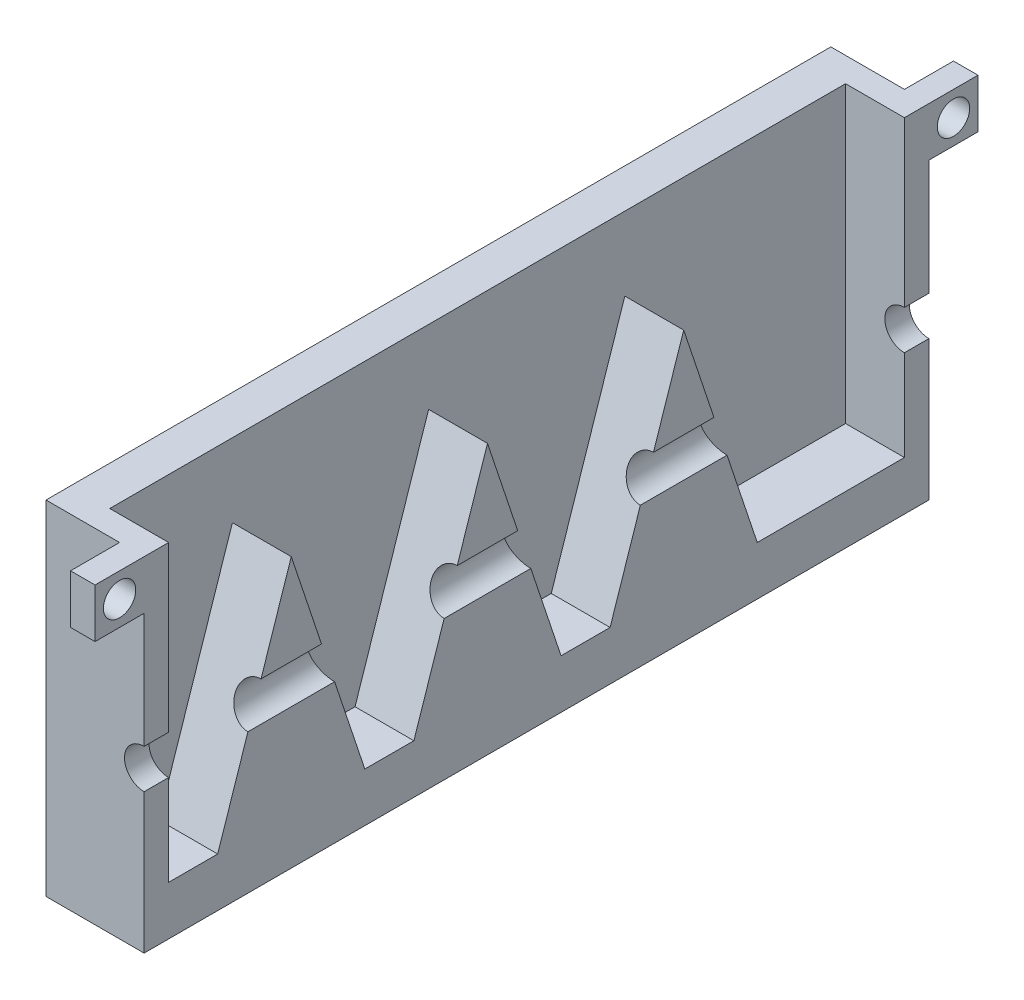
ISO-10303-21;
HEADER;
FILE_DESCRIPTION(('STEP AP214'),'2;1');
FILE_NAME('part.step','',(''),(''),'','','');
FILE_SCHEMA(('AUTOMOTIVE_DESIGN { 1 0 10303 214 1 1 1 1 }'));
ENDSEC;
DATA;
#1=APPLICATION_CONTEXT('core data for automotive mechanical design processes');
#2=APPLICATION_PROTOCOL_DEFINITION('international standard','automotive_design',2000,#1);
#3=PRODUCT_CONTEXT('',#1,'mechanical');
#4=PRODUCT('Part','Part','',(#3));
#5=PRODUCT_RELATED_PRODUCT_CATEGORY('part','',(#4));
#6=PRODUCT_DEFINITION_FORMATION('','',#4);
#7=PRODUCT_DEFINITION_CONTEXT('part definition',#1,'design');
#8=PRODUCT_DEFINITION('design','',#6,#7);
#9=PRODUCT_DEFINITION_SHAPE('','',#8);
#10=(LENGTH_UNIT() NAMED_UNIT(*) SI_UNIT(.MILLI.,.METRE.));
#11=(NAMED_UNIT(*) PLANE_ANGLE_UNIT() SI_UNIT($,.RADIAN.));
#12=(NAMED_UNIT(*) SI_UNIT($,.STERADIAN.) SOLID_ANGLE_UNIT());
#13=UNCERTAINTY_MEASURE_WITH_UNIT(LENGTH_MEASURE(1.E-05),#10,'distance_accuracy_value','');
#14=(GEOMETRIC_REPRESENTATION_CONTEXT(3) GLOBAL_UNCERTAINTY_ASSIGNED_CONTEXT((#13)) GLOBAL_UNIT_ASSIGNED_CONTEXT((#10,
#11,#12)) REPRESENTATION_CONTEXT('',''));
#15=CARTESIAN_POINT('',(0.,0.,0.));
#16=DIRECTION('',(0.,0.,1.));
#17=DIRECTION('',(1.,0.,0.));
#18=AXIS2_PLACEMENT_3D('',#15,#16,#17);
#19=CARTESIAN_POINT('',(10.,0.,0.));
#20=DIRECTION('',(-1.,0.,0.));
#21=DIRECTION('',(0.,0.,1.));
#22=AXIS2_PLACEMENT_3D('',#19,#20,#21);
#23=PLANE('',#22);
#24=DIRECTION('',(0.,0.948683298050514,-0.316227766016838));
#25=VECTOR('',#24,1.);
#26=CARTESIAN_POINT('',(9.99999999999999,5.00000000000001,-27.5));
#27=LINE('',#26,#25);
#28=CARTESIAN_POINT('',(9.99999999999998,18.25,-31.9166666666667));
#29=VERTEX_POINT('',#28);
#30=CARTESIAN_POINT('',(9.99999999999999,27.5,-35.));
#31=VERTEX_POINT('',#30);
#32=EDGE_CURVE('E423',#29,#31,#27,.T.);
#33=ORIENTED_EDGE('',*,*,#32,.F.);
#34=DIRECTION('',(0.,0.,1.));
#35=VECTOR('',#34,1.);
#36=CARTESIAN_POINT('',(9.99999999999998,18.25,-85.6568542494924));
#37=LINE('',#36,#35);
#38=CARTESIAN_POINT('',(9.99999999999998,18.25,-38.0833333333333));
#39=VERTEX_POINT('',#38);
#40=EDGE_CURVE('E459',#39,#29,#37,.T.);
#41=ORIENTED_EDGE('',*,*,#40,.F.);
#42=DIRECTION('',(0.,-0.948683298050514,-0.316227766016838));
#43=VECTOR('',#42,1.);
#44=CARTESIAN_POINT('',(9.99999999999999,27.5,-35.));
#45=LINE('',#44,#43);
#46=EDGE_CURVE('E463',#31,#39,#45,.T.);
#47=ORIENTED_EDGE('',*,*,#46,.F.);
#48=EDGE_LOOP('',(#33,#41,#47));
#49=FACE_BOUND('',#48,.T.);
#50=ADVANCED_FACE('F32',(#49),#23,.F.);
#51=DIRECTION('',(0.,0.948683298050514,-0.316227766016838));
#52=VECTOR('',#51,1.);
#53=CARTESIAN_POINT('',(9.99999999999999,5.00000000000001,-47.5));
#54=LINE('',#53,#52);
#55=CARTESIAN_POINT('',(9.99999999999998,18.25,-51.9166666666667));
#56=VERTEX_POINT('',#55);
#57=CARTESIAN_POINT('',(9.99999999999999,27.5,-55.));
#58=VERTEX_POINT('',#57);
#59=EDGE_CURVE('E465',#56,#58,#54,.T.);
#60=ORIENTED_EDGE('',*,*,#59,.F.);
#61=DIRECTION('',(0.,0.,1.));
#62=VECTOR('',#61,1.);
#63=CARTESIAN_POINT('',(9.99999999999998,18.25,-85.6568542494924));
#64=LINE('',#63,#62);
#65=CARTESIAN_POINT('',(9.99999999999998,18.25,-58.0833333333334));
#66=VERTEX_POINT('',#65);
#67=EDGE_CURVE('E441',#66,#56,#64,.T.);
#68=ORIENTED_EDGE('',*,*,#67,.F.);
#69=DIRECTION('',(0.,-0.948683298050514,-0.316227766016838));
#70=VECTOR('',#69,1.);
#71=CARTESIAN_POINT('',(9.99999999999999,27.5,-55.));
#72=LINE('',#71,#70);
#73=EDGE_CURVE('E454',#58,#66,#72,.T.);
#74=ORIENTED_EDGE('',*,*,#73,.F.);
#75=EDGE_LOOP('',(#60,#68,#74));
#76=FACE_BOUND('',#75,.T.);
#77=ADVANCED_FACE('F538',(#76),#23,.F.);
#78=DIRECTION('',(0.,0.948683298050514,-0.316227766016838));
#79=VECTOR('',#78,1.);
#80=CARTESIAN_POINT('',(10.,5.00000000000001,-7.50000000000001));
#81=LINE('',#80,#79);
#82=CARTESIAN_POINT('',(9.99999999999998,18.25,-11.9166666666667));
#83=VERTEX_POINT('',#82);
#84=CARTESIAN_POINT('',(10.,27.5,-15.));
#85=VERTEX_POINT('',#84);
#86=EDGE_CURVE('E431',#83,#85,#81,.T.);
#87=ORIENTED_EDGE('',*,*,#86,.F.);
#88=DIRECTION('',(0.,0.,1.));
#89=VECTOR('',#88,1.);
#90=CARTESIAN_POINT('',(9.99999999999998,18.25,-85.6568542494924));
#91=LINE('',#90,#89);
#92=CARTESIAN_POINT('',(9.99999999999998,18.25,-18.0833333333334));
#93=VERTEX_POINT('',#92);
#94=EDGE_CURVE('E438',#93,#83,#91,.T.);
#95=ORIENTED_EDGE('',*,*,#94,.F.);
#96=DIRECTION('',(0.,-0.948683298050514,-0.316227766016838));
#97=VECTOR('',#96,1.);
#98=CARTESIAN_POINT('',(10.,27.5,-15.));
#99=LINE('',#98,#97);
#100=EDGE_CURVE('E434',#85,#93,#99,.T.);
#101=ORIENTED_EDGE('',*,*,#100,.F.);
#102=EDGE_LOOP('',(#87,#95,#101));
#103=FACE_BOUND('',#102,.T.);
#104=ADVANCED_FACE('F543',(#103),#23,.F.);
#105=CARTESIAN_POINT('',(9.99999999999998,32.5,-82.5));
#106=DIRECTION('',(-1.,0.,0.));
#107=DIRECTION('',(0.,0.,1.));
#108=AXIS2_PLACEMENT_3D('',#105,#106,#107);
#109=CIRCLE('',#108,1.65);
#110=CARTESIAN_POINT('',(9.99999999999998,32.5,-80.85));
#111=VERTEX_POINT('',#110);
#112=EDGE_CURVE('E11',#111,#111,#109,.T.);
#113=ORIENTED_EDGE('',*,*,#112,.T.);
#114=EDGE_LOOP('',(#113));
#115=FACE_BOUND('',#114,.T.);
#116=DIRECTION('',(0.,0.,-1.));
#117=VECTOR('',#116,1.);
#118=CARTESIAN_POINT('',(9.99999999999998,30.,-85.));
#119=LINE('',#118,#117);
#120=CARTESIAN_POINT('',(9.99999999999998,30.,-80.));
#121=VERTEX_POINT('',#120);
#122=CARTESIAN_POINT('',(9.99999999999998,30.,-85.));
#123=VERTEX_POINT('',#122);
#124=EDGE_CURVE('E41',#121,#123,#119,.T.);
#125=ORIENTED_EDGE('',*,*,#124,.T.);
#126=DIRECTION('',(0.,-1.,0.));
#127=VECTOR('',#126,1.);
#128=CARTESIAN_POINT('',(9.99999999999998,0.,-85.));
#129=LINE('',#128,#127);
#130=CARTESIAN_POINT('',(9.99999999999998,35.,-85.));
#131=VERTEX_POINT('',#130);
#132=EDGE_CURVE('E462',#131,#123,#129,.T.);
#133=ORIENTED_EDGE('',*,*,#132,.F.);
#134=DIRECTION('',(0.,0.,1.));
#135=VECTOR('',#134,1.);
#136=CARTESIAN_POINT('',(10.,35.,0.));
#137=LINE('',#136,#135);
#138=CARTESIAN_POINT('',(9.99999999999998,35.,-77.5));
#139=VERTEX_POINT('',#138);
#140=EDGE_CURVE('E267',#131,#139,#137,.T.);
#141=ORIENTED_EDGE('',*,*,#140,.T.);
#142=DIRECTION('',(0.,-1.,0.));
#143=VECTOR('',#142,1.);
#144=CARTESIAN_POINT('',(9.99999999999998,5.00000000000001,-77.5));
#145=LINE('',#144,#143);
#146=CARTESIAN_POINT('',(9.99999999999998,18.25,-77.5));
#147=VERTEX_POINT('',#146);
#148=EDGE_CURVE('E56',#139,#147,#145,.T.);
#149=ORIENTED_EDGE('',*,*,#148,.T.);
#150=DIRECTION('',(0.,0.,1.));
#151=VECTOR('',#150,1.);
#152=CARTESIAN_POINT('',(9.99999999999998,18.25,-85.6568542494924));
#153=LINE('',#152,#151);
#154=CARTESIAN_POINT('',(9.99999999999998,18.25,-80.));
#155=VERTEX_POINT('',#154);
#156=EDGE_CURVE('E406',#155,#147,#153,.T.);
#157=ORIENTED_EDGE('',*,*,#156,.F.);
#158=DIRECTION('',(0.,1.,0.));
#159=VECTOR('',#158,1.);
#160=CARTESIAN_POINT('',(9.99999999999998,35.,-80.));
#161=LINE('',#160,#159);
#162=EDGE_CURVE('E48',#155,#121,#161,.T.);
#163=ORIENTED_EDGE('',*,*,#162,.T.);
#164=EDGE_LOOP('',(#125,#133,#141,#149,#157,#163));
#165=FACE_BOUND('',#164,.T.);
#166=ADVANCED_FACE('F556',(#115,#165),#23,.F.);
#167=DIRECTION('',(0.,0.,1.));
#168=VECTOR('',#167,1.);
#169=CARTESIAN_POINT('',(10.,5.00000000000001,-2.50000000000001));
#170=LINE('',#169,#168);
#171=CARTESIAN_POINT('',(9.99999999999999,5.00000000000001,-47.5));
#172=VERTEX_POINT('',#171);
#173=CARTESIAN_POINT('',(9.99999999999999,5.00000000000001,-42.5));
#174=VERTEX_POINT('',#173);
#175=EDGE_CURVE('E418',#172,#174,#170,.T.);
#176=ORIENTED_EDGE('',*,*,#175,.T.);
#177=CARTESIAN_POINT('',(9.99999999999998,14.25,-39.4166666666667));
#178=VERTEX_POINT('',#177);
#179=EDGE_CURVE('E453',#178,#174,#45,.T.);
#180=ORIENTED_EDGE('',*,*,#179,.F.);
#181=DIRECTION('',(0.,0.,1.));
#182=VECTOR('',#181,1.);
#183=CARTESIAN_POINT('',(9.99999999999998,14.25,-85.6568542494924));
#184=LINE('',#183,#182);
#185=CARTESIAN_POINT('',(9.99999999999998,14.25,-30.5833333333333));
#186=VERTEX_POINT('',#185);
#187=EDGE_CURVE('E460',#186,#178,#184,.F.);
#188=ORIENTED_EDGE('',*,*,#187,.F.);
#189=CARTESIAN_POINT('',(9.99999999999999,5.00000000000001,-27.5));
#190=VERTEX_POINT('',#189);
#191=EDGE_CURVE('E451',#190,#186,#27,.T.);
#192=ORIENTED_EDGE('',*,*,#191,.F.);
#193=DIRECTION('',(0.,0.,1.));
#194=VECTOR('',#193,1.);
#195=CARTESIAN_POINT('',(10.,5.00000000000001,-2.50000000000001));
#196=LINE('',#195,#194);
#197=CARTESIAN_POINT('',(10.,5.00000000000001,-22.5));
#198=VERTEX_POINT('',#197);
#199=EDGE_CURVE('E448',#190,#198,#196,.T.);
#200=ORIENTED_EDGE('',*,*,#199,.T.);
#201=CARTESIAN_POINT('',(9.99999999999998,14.25,-19.4166666666667));
#202=VERTEX_POINT('',#201);
#203=EDGE_CURVE('E430',#202,#198,#99,.T.);
#204=ORIENTED_EDGE('',*,*,#203,.F.);
#205=DIRECTION('',(0.,0.,1.));
#206=VECTOR('',#205,1.);
#207=CARTESIAN_POINT('',(9.99999999999998,14.25,-85.6568542494924));
#208=LINE('',#207,#206);
#209=CARTESIAN_POINT('',(9.99999999999998,14.25,-10.5833333333334));
#210=VERTEX_POINT('',#209);
#211=EDGE_CURVE('E439',#210,#202,#208,.F.);
#212=ORIENTED_EDGE('',*,*,#211,.F.);
#213=CARTESIAN_POINT('',(10.,5.00000000000001,-7.50000000000001));
#214=VERTEX_POINT('',#213);
#215=EDGE_CURVE('E428',#214,#210,#81,.T.);
#216=ORIENTED_EDGE('',*,*,#215,.F.);
#217=DIRECTION('',(0.,0.,1.));
#218=VECTOR('',#217,1.);
#219=CARTESIAN_POINT('',(10.,5.00000000000001,-2.50000000000001));
#220=LINE('',#219,#218);
#221=CARTESIAN_POINT('',(10.,5.00000000000001,-2.50000000000001));
#222=VERTEX_POINT('',#221);
#223=EDGE_CURVE('E424',#214,#222,#220,.T.);
#224=ORIENTED_EDGE('',*,*,#223,.T.);
#225=DIRECTION('',(0.,1.,0.));
#226=VECTOR('',#225,1.);
#227=CARTESIAN_POINT('',(10.,5.00000000000001,-2.50000000000001));
#228=LINE('',#227,#226);
#229=CARTESIAN_POINT('',(9.99999999999998,14.25,-2.50000000000002));
#230=VERTEX_POINT('',#229);
#231=EDGE_CURVE('E410',#222,#230,#228,.T.);
#232=ORIENTED_EDGE('',*,*,#231,.T.);
#233=DIRECTION('',(0.,0.,1.));
#234=VECTOR('',#233,1.);
#235=CARTESIAN_POINT('',(9.99999999999998,14.25,-85.6568542494924));
#236=LINE('',#235,#234);
#237=CARTESIAN_POINT('',(9.99999999999998,14.25,0.));
#238=VERTEX_POINT('',#237);
#239=EDGE_CURVE('E404',#238,#230,#236,.F.);
#240=ORIENTED_EDGE('',*,*,#239,.F.);
#241=DIRECTION('',(0.,1.,0.));
#242=VECTOR('',#241,1.);
#243=CARTESIAN_POINT('',(10.,35.,0.));
#244=LINE('',#243,#242);
#245=CARTESIAN_POINT('',(9.99999999999999,0.,0.));
#246=VERTEX_POINT('',#245);
#247=EDGE_CURVE('E411',#246,#238,#244,.T.);
#248=ORIENTED_EDGE('',*,*,#247,.F.);
#249=DIRECTION('',(0.,0.,1.));
#250=VECTOR('',#249,1.);
#251=CARTESIAN_POINT('',(10.,0.,0.));
#252=LINE('',#251,#250);
#253=CARTESIAN_POINT('',(9.99999999999999,0.,-80.));
#254=VERTEX_POINT('',#253);
#255=EDGE_CURVE('E432',#254,#246,#252,.T.);
#256=ORIENTED_EDGE('',*,*,#255,.F.);
#257=CARTESIAN_POINT('',(9.99999999999998,14.25,-80.));
#258=VERTEX_POINT('',#257);
#259=EDGE_CURVE('E413',#254,#258,#161,.T.);
#260=ORIENTED_EDGE('',*,*,#259,.T.);
#261=DIRECTION('',(0.,0.,1.));
#262=VECTOR('',#261,1.);
#263=CARTESIAN_POINT('',(9.99999999999998,14.25,-85.6568542494924));
#264=LINE('',#263,#262);
#265=CARTESIAN_POINT('',(9.99999999999998,14.25,-77.5));
#266=VERTEX_POINT('',#265);
#267=EDGE_CURVE('E436',#266,#258,#264,.F.);
#268=ORIENTED_EDGE('',*,*,#267,.F.);
#269=CARTESIAN_POINT('',(9.99999999999998,5.00000000000001,-77.5));
#270=VERTEX_POINT('',#269);
#271=EDGE_CURVE('E443',#266,#270,#145,.T.);
#272=ORIENTED_EDGE('',*,*,#271,.T.);
#273=DIRECTION('',(0.,0.,1.));
#274=VECTOR('',#273,1.);
#275=CARTESIAN_POINT('',(10.,5.00000000000001,-2.50000000000001));
#276=LINE('',#275,#274);
#277=CARTESIAN_POINT('',(9.99999999999999,5.00000000000001,-62.5));
#278=VERTEX_POINT('',#277);
#279=EDGE_CURVE('E427',#270,#278,#276,.T.);
#280=ORIENTED_EDGE('',*,*,#279,.T.);
#281=CARTESIAN_POINT('',(9.99999999999998,14.25,-59.4166666666667));
#282=VERTEX_POINT('',#281);
#283=EDGE_CURVE('E456',#282,#278,#72,.T.);
#284=ORIENTED_EDGE('',*,*,#283,.F.);
#285=DIRECTION('',(0.,0.,1.));
#286=VECTOR('',#285,1.);
#287=CARTESIAN_POINT('',(9.99999999999998,14.25,-85.6568542494924));
#288=LINE('',#287,#286);
#289=CARTESIAN_POINT('',(9.99999999999998,14.25,-50.5833333333333));
#290=VERTEX_POINT('',#289);
#291=EDGE_CURVE('E457',#290,#282,#288,.F.);
#292=ORIENTED_EDGE('',*,*,#291,.F.);
#293=EDGE_CURVE('E466',#172,#290,#54,.T.);
#294=ORIENTED_EDGE('',*,*,#293,.F.);
#295=EDGE_LOOP('',(#176,#180,#188,#192,#200,#204,#212,#216,#224,#232,#240,#248,#256,#260,#268,
#272,#280,#284,#292,#294));
#296=FACE_BOUND('',#295,.T.);
#297=ADVANCED_FACE('F34',(#296),#23,.F.);
#298=CARTESIAN_POINT('',(9.99999999999998,18.25,0.));
#299=VERTEX_POINT('',#298);
#300=CARTESIAN_POINT('',(10.,30.,0.));
#301=VERTEX_POINT('',#300);
#302=EDGE_CURVE('E414',#299,#301,#244,.T.);
#303=ORIENTED_EDGE('',*,*,#302,.F.);
#304=DIRECTION('',(0.,0.,1.));
#305=VECTOR('',#304,1.);
#306=CARTESIAN_POINT('',(9.99999999999998,18.25,-85.6568542494924));
#307=LINE('',#306,#305);
#308=CARTESIAN_POINT('',(9.99999999999998,18.25,-2.50000000000002));
#309=VERTEX_POINT('',#308);
#310=EDGE_CURVE('E397',#309,#299,#307,.T.);
#311=ORIENTED_EDGE('',*,*,#310,.F.);
#312=CARTESIAN_POINT('',(10.,35.,-2.50000000000001));
#313=VERTEX_POINT('',#312);
#314=EDGE_CURVE('E407',#309,#313,#228,.T.);
#315=ORIENTED_EDGE('',*,*,#314,.T.);
#316=CARTESIAN_POINT('',(10.,35.,5.));
#317=VERTEX_POINT('',#316);
#318=EDGE_CURVE('E415',#313,#317,#137,.T.);
#319=ORIENTED_EDGE('',*,*,#318,.T.);
#320=DIRECTION('',(0.,1.,0.));
#321=VECTOR('',#320,1.);
#322=CARTESIAN_POINT('',(10.,0.,5.));
#323=LINE('',#322,#321);
#324=CARTESIAN_POINT('',(10.,30.,5.));
#325=VERTEX_POINT('',#324);
#326=EDGE_CURVE('E419',#325,#317,#323,.T.);
#327=ORIENTED_EDGE('',*,*,#326,.F.);
#328=DIRECTION('',(0.,0.,1.));
#329=VECTOR('',#328,1.);
#330=CARTESIAN_POINT('',(10.,30.,5.));
#331=LINE('',#330,#329);
#332=EDGE_CURVE('E421',#301,#325,#331,.T.);
#333=ORIENTED_EDGE('',*,*,#332,.F.);
#334=EDGE_LOOP('',(#303,#311,#315,#319,#327,#333));
#335=FACE_BOUND('',#334,.T.);
#336=CARTESIAN_POINT('',(10.,32.5,2.5));
#337=DIRECTION('',(-1.,0.,0.));
#338=DIRECTION('',(0.,0.,1.));
#339=AXIS2_PLACEMENT_3D('',#336,#337,#338);
#340=CIRCLE('',#339,1.65);
#341=CARTESIAN_POINT('',(10.,32.5,4.15));
#342=VERTEX_POINT('',#341);
#343=EDGE_CURVE('E36',#342,#342,#340,.F.);
#344=ORIENTED_EDGE('',*,*,#343,.F.);
#345=EDGE_LOOP('',(#344));
#346=FACE_BOUND('',#345,.T.);
#347=ADVANCED_FACE('F539',(#335,#346),#23,.F.);
#348=CARTESIAN_POINT('',(0.,35.,0.));
#349=DIRECTION('',(-1.,0.,0.));
#350=DIRECTION('',(0.,0.,1.));
#351=AXIS2_PLACEMENT_3D('',#348,#349,#350);
#352=PLANE('',#351);
#353=DIRECTION('',(0.,0.,-1.));
#354=VECTOR('',#353,1.);
#355=CARTESIAN_POINT('',(0.,0.,0.));
#356=LINE('',#355,#354);
#357=CARTESIAN_POINT('',(0.,0.,0.));
#358=VERTEX_POINT('',#357);
#359=CARTESIAN_POINT('',(0.,0.,-80.));
#360=VERTEX_POINT('',#359);
#361=EDGE_CURVE('E381',#358,#360,#356,.T.);
#362=ORIENTED_EDGE('',*,*,#361,.F.);
#363=DIRECTION('',(0.,-1.,0.));
#364=VECTOR('',#363,1.);
#365=CARTESIAN_POINT('',(0.,35.,0.));
#366=LINE('',#365,#364);
#367=CARTESIAN_POINT('',(0.,35.,0.));
#368=VERTEX_POINT('',#367);
#369=EDGE_CURVE('E386',#368,#358,#366,.T.);
#370=ORIENTED_EDGE('',*,*,#369,.F.);
#371=DIRECTION('',(0.,0.,-1.));
#372=VECTOR('',#371,1.);
#373=CARTESIAN_POINT('',(0.,35.,0.));
#374=LINE('',#373,#372);
#375=CARTESIAN_POINT('',(0.,35.,-80.));
#376=VERTEX_POINT('',#375);
#377=EDGE_CURVE('E383',#368,#376,#374,.T.);
#378=ORIENTED_EDGE('',*,*,#377,.T.);
#379=DIRECTION('',(0.,-1.,0.));
#380=VECTOR('',#379,1.);
#381=CARTESIAN_POINT('',(0.,35.,-80.));
#382=LINE('',#381,#380);
#383=EDGE_CURVE('E395',#376,#360,#382,.T.);
#384=ORIENTED_EDGE('',*,*,#383,.T.);
#385=EDGE_LOOP('',(#362,#370,#378,#384));
#386=FACE_BOUND('',#385,.T.);
#387=ADVANCED_FACE('F546',(#386),#352,.T.);
#388=CARTESIAN_POINT('',(4.,5.00000000000001,-2.50000000000001));
#389=DIRECTION('',(0.,1.,0.));
#390=DIRECTION('',(0.,0.,-1.));
#391=AXIS2_PLACEMENT_3D('',#388,#389,#390);
#392=PLANE('',#391);
#393=ORIENTED_EDGE('',*,*,#279,.F.);
#394=DIRECTION('',(1.,0.,0.));
#395=VECTOR('',#394,1.);
#396=CARTESIAN_POINT('',(3.99999999999998,5.00000000000001,-77.5));
#397=LINE('',#396,#395);
#398=CARTESIAN_POINT('',(3.99999999999998,5.00000000000001,-77.5));
#399=VERTEX_POINT('',#398);
#400=EDGE_CURVE('E365',#399,#270,#397,.T.);
#401=ORIENTED_EDGE('',*,*,#400,.F.);
#402=DIRECTION('',(0.,0.,1.));
#403=VECTOR('',#402,1.);
#404=CARTESIAN_POINT('',(4.,5.00000000000001,-2.50000000000001));
#405=LINE('',#404,#403);
#406=CARTESIAN_POINT('',(3.99999999999999,5.00000000000001,-62.5));
#407=VERTEX_POINT('',#406);
#408=EDGE_CURVE('E353',#399,#407,#405,.T.);
#409=ORIENTED_EDGE('',*,*,#408,.T.);
#410=DIRECTION('',(1.,0.,0.));
#411=VECTOR('',#410,1.);
#412=CARTESIAN_POINT('',(-23.0416345659799,5.00000000000001,-62.5));
#413=LINE('',#412,#411);
#414=EDGE_CURVE('E305',#407,#278,#413,.T.);
#415=ORIENTED_EDGE('',*,*,#414,.T.);
#416=EDGE_LOOP('',(#393,#401,#409,#415));
#417=FACE_BOUND('',#416,.T.);
#418=ADVANCED_FACE('F553',(#417),#392,.T.);
#419=ORIENTED_EDGE('',*,*,#175,.F.);
#420=DIRECTION('',(1.,0.,0.));
#421=VECTOR('',#420,1.);
#422=CARTESIAN_POINT('',(-23.0416345659799,5.00000000000001,-47.5));
#423=LINE('',#422,#421);
#424=CARTESIAN_POINT('',(3.99999999999999,5.00000000000001,-47.5));
#425=VERTEX_POINT('',#424);
#426=EDGE_CURVE('E333',#425,#172,#423,.T.);
#427=ORIENTED_EDGE('',*,*,#426,.F.);
#428=CARTESIAN_POINT('',(3.99999999999999,5.00000000000001,-42.5));
#429=VERTEX_POINT('',#428);
#430=EDGE_CURVE('E357',#425,#429,#405,.T.);
#431=ORIENTED_EDGE('',*,*,#430,.T.);
#432=DIRECTION('',(1.,0.,0.));
#433=VECTOR('',#432,1.);
#434=CARTESIAN_POINT('',(-23.0416345659799,5.00000000000001,-42.5));
#435=LINE('',#434,#433);
#436=EDGE_CURVE('E313',#429,#174,#435,.T.);
#437=ORIENTED_EDGE('',*,*,#436,.T.);
#438=EDGE_LOOP('',(#419,#427,#431,#437));
#439=FACE_BOUND('',#438,.T.);
#440=ADVANCED_FACE('F642',(#439),#392,.T.);
#441=CARTESIAN_POINT('',(4.,5.00000000000001,-2.50000000000001));
#442=DIRECTION('',(1.,0.,0.));
#443=DIRECTION('',(0.,0.,-1.));
#444=AXIS2_PLACEMENT_3D('',#441,#442,#443);
#445=PLANE('',#444);
#446=DIRECTION('',(0.,0.948683298050514,0.316227766016838));
#447=VECTOR('',#446,1.);
#448=CARTESIAN_POINT('',(3.99999999999999,27.5,-35.));
#449=LINE('',#448,#447);
#450=CARTESIAN_POINT('',(3.99999999999999,27.5,-35.));
#451=VERTEX_POINT('',#450);
#452=EDGE_CURVE('E312',#429,#451,#449,.T.);
#453=ORIENTED_EDGE('',*,*,#452,.F.);
#454=ORIENTED_EDGE('',*,*,#430,.F.);
#455=DIRECTION('',(0.,-0.948683298050514,0.316227766016838));
#456=VECTOR('',#455,1.);
#457=CARTESIAN_POINT('',(3.99999999999999,5.00000000000001,-47.5));
#458=LINE('',#457,#456);
#459=CARTESIAN_POINT('',(3.99999999999999,27.5,-55.));
#460=VERTEX_POINT('',#459);
#461=EDGE_CURVE('E317',#460,#425,#458,.T.);
#462=ORIENTED_EDGE('',*,*,#461,.F.);
#463=DIRECTION('',(0.,0.948683298050514,0.316227766016838));
#464=VECTOR('',#463,1.);
#465=CARTESIAN_POINT('',(3.99999999999999,27.5,-55.));
#466=LINE('',#465,#464);
#467=EDGE_CURVE('E327',#407,#460,#466,.T.);
#468=ORIENTED_EDGE('',*,*,#467,.F.);
#469=ORIENTED_EDGE('',*,*,#408,.F.);
#470=DIRECTION('',(0.,-1.,0.));
#471=VECTOR('',#470,1.);
#472=CARTESIAN_POINT('',(3.99999999999998,5.00000000000001,-77.5));
#473=LINE('',#472,#471);
#474=CARTESIAN_POINT('',(3.99999999999998,35.,-77.5));
#475=VERTEX_POINT('',#474);
#476=EDGE_CURVE('E363',#475,#399,#473,.T.);
#477=ORIENTED_EDGE('',*,*,#476,.F.);
#478=DIRECTION('',(0.,0.,-1.));
#479=VECTOR('',#478,1.);
#480=CARTESIAN_POINT('',(4.,35.,-2.50000000000001));
#481=LINE('',#480,#479);
#482=CARTESIAN_POINT('',(4.,35.,-2.50000000000001));
#483=VERTEX_POINT('',#482);
#484=EDGE_CURVE('E360',#483,#475,#481,.T.);
#485=ORIENTED_EDGE('',*,*,#484,.F.);
#486=DIRECTION('',(0.,1.,0.));
#487=VECTOR('',#486,1.);
#488=CARTESIAN_POINT('',(4.,5.00000000000001,-2.50000000000001));
#489=LINE('',#488,#487);
#490=CARTESIAN_POINT('',(4.,5.00000000000001,-2.50000000000001));
#491=VERTEX_POINT('',#490);
#492=EDGE_CURVE('E356',#491,#483,#489,.T.);
#493=ORIENTED_EDGE('',*,*,#492,.F.);
#494=CARTESIAN_POINT('',(4.,5.00000000000001,-7.50000000000001));
#495=VERTEX_POINT('',#494);
#496=EDGE_CURVE('E341',#495,#491,#405,.T.);
#497=ORIENTED_EDGE('',*,*,#496,.F.);
#498=DIRECTION('',(0.,-0.948683298050514,0.316227766016838));
#499=VECTOR('',#498,1.);
#500=CARTESIAN_POINT('',(4.,5.00000000000001,-7.50000000000001));
#501=LINE('',#500,#499);
#502=CARTESIAN_POINT('',(4.,27.5,-15.));
#503=VERTEX_POINT('',#502);
#504=EDGE_CURVE('E338',#503,#495,#501,.T.);
#505=ORIENTED_EDGE('',*,*,#504,.F.);
#506=DIRECTION('',(0.,0.948683298050514,0.316227766016838));
#507=VECTOR('',#506,1.);
#508=CARTESIAN_POINT('',(4.,27.5,-15.));
#509=LINE('',#508,#507);
#510=CARTESIAN_POINT('',(3.99999999999999,5.00000000000001,-22.5));
#511=VERTEX_POINT('',#510);
#512=EDGE_CURVE('E342',#511,#503,#509,.T.);
#513=ORIENTED_EDGE('',*,*,#512,.F.);
#514=CARTESIAN_POINT('',(3.99999999999999,5.00000000000001,-27.5));
#515=VERTEX_POINT('',#514);
#516=EDGE_CURVE('E358',#515,#511,#405,.T.);
#517=ORIENTED_EDGE('',*,*,#516,.F.);
#518=DIRECTION('',(0.,-0.948683298050514,0.316227766016838));
#519=VECTOR('',#518,1.);
#520=CARTESIAN_POINT('',(3.99999999999999,5.00000000000001,-27.5));
#521=LINE('',#520,#519);
#522=EDGE_CURVE('E308',#451,#515,#521,.T.);
#523=ORIENTED_EDGE('',*,*,#522,.F.);
#524=EDGE_LOOP('',(#453,#454,#462,#468,#469,#477,#485,#493,#497,#505,#513,#517,#523));
#525=FACE_BOUND('',#524,.T.);
#526=ADVANCED_FACE('F624',(#525),#445,.T.);
#527=ORIENTED_EDGE('',*,*,#199,.F.);
#528=DIRECTION('',(1.,0.,0.));
#529=VECTOR('',#528,1.);
#530=CARTESIAN_POINT('',(-23.0416345659799,5.00000000000001,-27.5));
#531=LINE('',#530,#529);
#532=EDGE_CURVE('E320',#515,#190,#531,.T.);
#533=ORIENTED_EDGE('',*,*,#532,.F.);
#534=ORIENTED_EDGE('',*,*,#516,.T.);
#535=DIRECTION('',(1.,0.,0.));
#536=VECTOR('',#535,1.);
#537=CARTESIAN_POINT('',(-23.0416345659799,5.00000000000001,-22.5));
#538=LINE('',#537,#536);
#539=EDGE_CURVE('E311',#511,#198,#538,.T.);
#540=ORIENTED_EDGE('',*,*,#539,.T.);
#541=EDGE_LOOP('',(#527,#533,#534,#540));
#542=FACE_BOUND('',#541,.T.);
#543=ADVANCED_FACE('F664',(#542),#392,.T.);
#544=CARTESIAN_POINT('',(-23.0416345659799,27.5,-35.));
#545=DIRECTION('',(0.,-0.316227766016838,0.948683298050514));
#546=DIRECTION('',(0.,0.948683298050514,0.316227766016838));
#547=AXIS2_PLACEMENT_3D('',#544,#545,#546);
#548=PLANE('',#547);
#549=DIRECTION('',(1.,0.,0.));
#550=VECTOR('',#549,1.);
#551=CARTESIAN_POINT('',(-23.0416345659799,27.5,-35.));
#552=LINE('',#551,#550);
#553=EDGE_CURVE('E316',#451,#31,#552,.T.);
#554=ORIENTED_EDGE('',*,*,#553,.T.);
#555=ORIENTED_EDGE('',*,*,#46,.T.);
#556=CARTESIAN_POINT('',(10.,16.25,-38.75));
#557=DIRECTION('',(0.,-0.316227766016838,0.948683298050514));
#558=DIRECTION('',(0.,0.948683298050514,0.316227766016838));
#559=AXIS2_PLACEMENT_3D('',#556,#557,#558);
#560=ELLIPSE('',#559,2.10818510677892,2.);
#561=EDGE_CURVE('E401',#39,#178,#560,.T.);
#562=ORIENTED_EDGE('',*,*,#561,.T.);
#563=ORIENTED_EDGE('',*,*,#179,.T.);
#564=ORIENTED_EDGE('',*,*,#436,.F.);
#565=ORIENTED_EDGE('',*,*,#452,.T.);
#566=EDGE_LOOP('',(#554,#555,#562,#563,#564,#565));
#567=FACE_BOUND('',#566,.T.);
#568=ADVANCED_FACE('F494',(#567),#548,.F.);
#569=CARTESIAN_POINT('',(-23.0416345659799,5.00000000000001,-27.5));
#570=DIRECTION('',(0.,-0.316227766016838,-0.948683298050514));
#571=DIRECTION('',(0.,-0.948683298050514,0.316227766016838));
#572=AXIS2_PLACEMENT_3D('',#569,#570,#571);
#573=PLANE('',#572);
#574=ORIENTED_EDGE('',*,*,#532,.T.);
#575=ORIENTED_EDGE('',*,*,#191,.T.);
#576=CARTESIAN_POINT('',(10.,16.25,-31.25));
#577=DIRECTION('',(0.,-0.316227766016838,-0.948683298050514));
#578=DIRECTION('',(0.,-0.948683298050514,0.316227766016838));
#579=AXIS2_PLACEMENT_3D('',#576,#577,#578);
#580=ELLIPSE('',#579,2.10818510677892,2.);
#581=EDGE_CURVE('E398',#186,#29,#580,.T.);
#582=ORIENTED_EDGE('',*,*,#581,.T.);
#583=ORIENTED_EDGE('',*,*,#32,.T.);
#584=ORIENTED_EDGE('',*,*,#553,.F.);
#585=ORIENTED_EDGE('',*,*,#522,.T.);
#586=EDGE_LOOP('',(#574,#575,#582,#583,#584,#585));
#587=FACE_BOUND('',#586,.T.);
#588=ADVANCED_FACE('F486',(#587),#573,.F.);
#589=CARTESIAN_POINT('',(10.,16.25,-85.6568542494924));
#590=DIRECTION('',(0.,0.,1.));
#591=DIRECTION('',(1.,0.,0.));
#592=AXIS2_PLACEMENT_3D('',#589,#590,#591);
#593=CYLINDRICAL_SURFACE('',#592,2.);
#594=ORIENTED_EDGE('',*,*,#581,.F.);
#595=ORIENTED_EDGE('',*,*,#187,.T.);
#596=ORIENTED_EDGE('',*,*,#561,.F.);
#597=ORIENTED_EDGE('',*,*,#40,.T.);
#598=EDGE_LOOP('',(#594,#595,#596,#597));
#599=FACE_BOUND('',#598,.T.);
#600=ADVANCED_FACE('F480',(#599),#593,.F.);
#601=CARTESIAN_POINT('',(-23.0416345659799,27.5,-55.));
#602=DIRECTION('',(0.,-0.316227766016838,0.948683298050514));
#603=DIRECTION('',(0.,0.948683298050514,0.316227766016838));
#604=AXIS2_PLACEMENT_3D('',#601,#602,#603);
#605=PLANE('',#604);
#606=DIRECTION('',(1.,0.,0.));
#607=VECTOR('',#606,1.);
#608=CARTESIAN_POINT('',(-23.0416345659799,27.5,-55.));
#609=LINE('',#608,#607);
#610=EDGE_CURVE('E330',#460,#58,#609,.T.);
#611=ORIENTED_EDGE('',*,*,#610,.T.);
#612=ORIENTED_EDGE('',*,*,#73,.T.);
#613=CARTESIAN_POINT('',(10.,16.25,-58.75));
#614=DIRECTION('',(0.,-0.316227766016838,0.948683298050514));
#615=DIRECTION('',(0.,0.948683298050514,0.316227766016838));
#616=AXIS2_PLACEMENT_3D('',#613,#614,#615);
#617=ELLIPSE('',#616,2.10818510677892,2.);
#618=EDGE_CURVE('E498',#66,#282,#617,.T.);
#619=ORIENTED_EDGE('',*,*,#618,.T.);
#620=ORIENTED_EDGE('',*,*,#283,.T.);
#621=ORIENTED_EDGE('',*,*,#414,.F.);
#622=ORIENTED_EDGE('',*,*,#467,.T.);
#623=EDGE_LOOP('',(#611,#612,#619,#620,#621,#622));
#624=FACE_BOUND('',#623,.T.);
#625=ADVANCED_FACE('F633',(#624),#605,.F.);
#626=CARTESIAN_POINT('',(-23.0416345659799,5.00000000000001,-47.5));
#627=DIRECTION('',(0.,-0.316227766016838,-0.948683298050514));
#628=DIRECTION('',(0.,-0.948683298050514,0.316227766016838));
#629=AXIS2_PLACEMENT_3D('',#626,#627,#628);
#630=PLANE('',#629);
#631=ORIENTED_EDGE('',*,*,#426,.T.);
#632=ORIENTED_EDGE('',*,*,#293,.T.);
#633=CARTESIAN_POINT('',(10.,16.25,-51.25));
#634=DIRECTION('',(0.,-0.316227766016838,-0.948683298050514));
#635=DIRECTION('',(0.,-0.948683298050514,0.316227766016838));
#636=AXIS2_PLACEMENT_3D('',#633,#634,#635);
#637=ELLIPSE('',#636,2.10818510677892,2.);
#638=EDGE_CURVE('E495',#290,#56,#637,.T.);
#639=ORIENTED_EDGE('',*,*,#638,.T.);
#640=ORIENTED_EDGE('',*,*,#59,.T.);
#641=ORIENTED_EDGE('',*,*,#610,.F.);
#642=ORIENTED_EDGE('',*,*,#461,.T.);
#643=EDGE_LOOP('',(#631,#632,#639,#640,#641,#642));
#644=FACE_BOUND('',#643,.T.);
#645=ADVANCED_FACE('F639',(#644),#630,.F.);
#646=ORIENTED_EDGE('',*,*,#638,.F.);
#647=ORIENTED_EDGE('',*,*,#291,.T.);
#648=ORIENTED_EDGE('',*,*,#618,.F.);
#649=ORIENTED_EDGE('',*,*,#67,.T.);
#650=EDGE_LOOP('',(#646,#647,#648,#649));
#651=FACE_BOUND('',#650,.T.);
#652=ADVANCED_FACE('F534',(#651),#593,.F.);
#653=ORIENTED_EDGE('',*,*,#223,.F.);
#654=DIRECTION('',(1.,0.,0.));
#655=VECTOR('',#654,1.);
#656=CARTESIAN_POINT('',(-23.0416345659799,5.00000000000001,-7.50000000000001));
#657=LINE('',#656,#655);
#658=EDGE_CURVE('E348',#495,#214,#657,.T.);
#659=ORIENTED_EDGE('',*,*,#658,.F.);
#660=ORIENTED_EDGE('',*,*,#496,.T.);
#661=DIRECTION('',(1.,0.,0.));
#662=VECTOR('',#661,1.);
#663=CARTESIAN_POINT('',(4.,5.00000000000001,-2.50000000000001));
#664=LINE('',#663,#662);
#665=EDGE_CURVE('E373',#491,#222,#664,.T.);
#666=ORIENTED_EDGE('',*,*,#665,.T.);
#667=EDGE_LOOP('',(#653,#659,#660,#666));
#668=FACE_BOUND('',#667,.T.);
#669=ADVANCED_FACE('F651',(#668),#392,.T.);
#670=CARTESIAN_POINT('',(-23.0416345659799,27.5,-15.));
#671=DIRECTION('',(0.,-0.316227766016838,0.948683298050514));
#672=DIRECTION('',(0.,0.948683298050514,0.316227766016838));
#673=AXIS2_PLACEMENT_3D('',#670,#671,#672);
#674=PLANE('',#673);
#675=DIRECTION('',(1.,0.,0.));
#676=VECTOR('',#675,1.);
#677=CARTESIAN_POINT('',(-23.0416345659799,27.5,-15.));
#678=LINE('',#677,#676);
#679=EDGE_CURVE('E345',#503,#85,#678,.T.);
#680=ORIENTED_EDGE('',*,*,#679,.T.);
#681=ORIENTED_EDGE('',*,*,#100,.T.);
#682=CARTESIAN_POINT('',(10.,16.25,-18.75));
#683=DIRECTION('',(0.,-0.316227766016838,0.948683298050514));
#684=DIRECTION('',(0.,0.948683298050514,0.316227766016838));
#685=AXIS2_PLACEMENT_3D('',#682,#683,#684);
#686=ELLIPSE('',#685,2.10818510677892,2.);
#687=EDGE_CURVE('E508',#93,#202,#686,.T.);
#688=ORIENTED_EDGE('',*,*,#687,.T.);
#689=ORIENTED_EDGE('',*,*,#203,.T.);
#690=ORIENTED_EDGE('',*,*,#539,.F.);
#691=ORIENTED_EDGE('',*,*,#512,.T.);
#692=EDGE_LOOP('',(#680,#681,#688,#689,#690,#691));
#693=FACE_BOUND('',#692,.T.);
#694=ADVANCED_FACE('F663',(#693),#674,.F.);
#695=CARTESIAN_POINT('',(-23.0416345659799,5.00000000000001,-7.50000000000001));
#696=DIRECTION('',(0.,-0.316227766016838,-0.948683298050514));
#697=DIRECTION('',(0.,-0.948683298050514,0.316227766016838));
#698=AXIS2_PLACEMENT_3D('',#695,#696,#697);
#699=PLANE('',#698);
#700=ORIENTED_EDGE('',*,*,#658,.T.);
#701=ORIENTED_EDGE('',*,*,#215,.T.);
#702=CARTESIAN_POINT('',(10.,16.25,-11.25));
#703=DIRECTION('',(0.,-0.316227766016838,-0.948683298050514));
#704=DIRECTION('',(0.,-0.948683298050514,0.316227766016838));
#705=AXIS2_PLACEMENT_3D('',#702,#703,#704);
#706=ELLIPSE('',#705,2.10818510677892,2.);
#707=EDGE_CURVE('E505',#210,#83,#706,.T.);
#708=ORIENTED_EDGE('',*,*,#707,.T.);
#709=ORIENTED_EDGE('',*,*,#86,.T.);
#710=ORIENTED_EDGE('',*,*,#679,.F.);
#711=ORIENTED_EDGE('',*,*,#504,.T.);
#712=EDGE_LOOP('',(#700,#701,#708,#709,#710,#711));
#713=FACE_BOUND('',#712,.T.);
#714=ADVANCED_FACE('F658',(#713),#699,.F.);
#715=ORIENTED_EDGE('',*,*,#707,.F.);
#716=ORIENTED_EDGE('',*,*,#211,.T.);
#717=ORIENTED_EDGE('',*,*,#687,.F.);
#718=ORIENTED_EDGE('',*,*,#94,.T.);
#719=EDGE_LOOP('',(#715,#716,#717,#718));
#720=FACE_BOUND('',#719,.T.);
#721=ADVANCED_FACE('F587',(#720),#593,.F.);
#722=CARTESIAN_POINT('',(4.,5.00000000000001,-2.50000000000001));
#723=DIRECTION('',(0.,0.,-1.));
#724=DIRECTION('',(0.,-1.,0.));
#725=AXIS2_PLACEMENT_3D('',#722,#723,#724);
#726=PLANE('',#725);
#727=ORIENTED_EDGE('',*,*,#231,.F.);
#728=ORIENTED_EDGE('',*,*,#665,.F.);
#729=ORIENTED_EDGE('',*,*,#492,.T.);
#730=DIRECTION('',(1.,0.,0.));
#731=VECTOR('',#730,1.);
#732=CARTESIAN_POINT('',(4.,35.,-2.50000000000001));
#733=LINE('',#732,#731);
#734=EDGE_CURVE('E370',#483,#313,#733,.T.);
#735=ORIENTED_EDGE('',*,*,#734,.T.);
#736=ORIENTED_EDGE('',*,*,#314,.F.);
#737=CARTESIAN_POINT('',(10.,16.25,-2.50000000000002));
#738=DIRECTION('',(0.,0.,-1.));
#739=DIRECTION('',(-1.,0.,0.));
#740=AXIS2_PLACEMENT_3D('',#737,#738,#739);
#741=CIRCLE('',#740,2.);
#742=EDGE_CURVE('E514',#230,#309,#741,.T.);
#743=ORIENTED_EDGE('',*,*,#742,.F.);
#744=EDGE_LOOP('',(#727,#728,#729,#735,#736,#743));
#745=FACE_BOUND('',#744,.T.);
#746=ADVANCED_FACE('F579',(#745),#726,.T.);
#747=CARTESIAN_POINT('',(0.,35.,0.));
#748=DIRECTION('',(0.,0.,-1.));
#749=DIRECTION('',(-1.,0.,0.));
#750=AXIS2_PLACEMENT_3D('',#747,#748,#749);
#751=PLANE('',#750);
#752=DIRECTION('',(1.,0.,0.));
#753=VECTOR('',#752,1.);
#754=CARTESIAN_POINT('',(0.,0.,0.));
#755=LINE('',#754,#753);
#756=EDGE_CURVE('E376',#358,#246,#755,.T.);
#757=ORIENTED_EDGE('',*,*,#756,.T.);
#758=ORIENTED_EDGE('',*,*,#247,.T.);
#759=CARTESIAN_POINT('',(10.,16.25,0.));
#760=DIRECTION('',(0.,0.,1.));
#761=DIRECTION('',(1.,0.,0.));
#762=AXIS2_PLACEMENT_3D('',#759,#760,#761);
#763=CIRCLE('',#762,2.);
#764=EDGE_CURVE('E606',#299,#238,#763,.T.);
#765=ORIENTED_EDGE('',*,*,#764,.F.);
#766=ORIENTED_EDGE('',*,*,#302,.T.);
#767=DIRECTION('',(1.,0.,0.));
#768=VECTOR('',#767,1.);
#769=CARTESIAN_POINT('',(7.5,30.,0.));
#770=LINE('',#769,#768);
#771=CARTESIAN_POINT('',(7.5,30.,0.));
#772=VERTEX_POINT('',#771);
#773=EDGE_CURVE('E287',#772,#301,#770,.T.);
#774=ORIENTED_EDGE('',*,*,#773,.F.);
#775=DIRECTION('',(0.,-1.,0.));
#776=VECTOR('',#775,1.);
#777=CARTESIAN_POINT('',(7.5,35.,0.));
#778=LINE('',#777,#776);
#779=CARTESIAN_POINT('',(7.5,35.,0.));
#780=VERTEX_POINT('',#779);
#781=EDGE_CURVE('E292',#780,#772,#778,.T.);
#782=ORIENTED_EDGE('',*,*,#781,.F.);
#783=DIRECTION('',(1.,0.,0.));
#784=VECTOR('',#783,1.);
#785=CARTESIAN_POINT('',(0.,35.,0.));
#786=LINE('',#785,#784);
#787=EDGE_CURVE('E377',#368,#780,#786,.T.);
#788=ORIENTED_EDGE('',*,*,#787,.F.);
#789=ORIENTED_EDGE('',*,*,#369,.T.);
#790=EDGE_LOOP('',(#757,#758,#765,#766,#774,#782,#788,#789));
#791=FACE_BOUND('',#790,.T.);
#792=ADVANCED_FACE('F576',(#791),#751,.F.);
#793=ORIENTED_EDGE('',*,*,#764,.T.);
#794=ORIENTED_EDGE('',*,*,#239,.T.);
#795=ORIENTED_EDGE('',*,*,#742,.T.);
#796=ORIENTED_EDGE('',*,*,#310,.T.);
#797=EDGE_LOOP('',(#793,#794,#795,#796));
#798=FACE_BOUND('',#797,.T.);
#799=ADVANCED_FACE('F578',(#798),#593,.F.);
#800=CARTESIAN_POINT('',(7.5,35.,5.));
#801=DIRECTION('',(1.,0.,0.));
#802=DIRECTION('',(0.,0.,-1.));
#803=AXIS2_PLACEMENT_3D('',#800,#801,#802);
#804=PLANE('',#803);
#805=CARTESIAN_POINT('',(7.5,32.5,2.5));
#806=DIRECTION('',(1.,0.,0.));
#807=DIRECTION('',(0.,1.,0.));
#808=AXIS2_PLACEMENT_3D('',#805,#806,#807);
#809=CIRCLE('',#808,1.65);
#810=CARTESIAN_POINT('',(7.5,34.15,2.5));
#811=VERTEX_POINT('',#810);
#812=EDGE_CURVE('E283',#811,#811,#809,.T.);
#813=ORIENTED_EDGE('',*,*,#812,.T.);
#814=EDGE_LOOP('',(#813));
#815=FACE_BOUND('',#814,.T.);
#816=ORIENTED_EDGE('',*,*,#781,.T.);
#817=DIRECTION('',(0.,0.,-1.));
#818=VECTOR('',#817,1.);
#819=CARTESIAN_POINT('',(7.5,30.,5.));
#820=LINE('',#819,#818);
#821=CARTESIAN_POINT('',(7.5,30.,5.));
#822=VERTEX_POINT('',#821);
#823=EDGE_CURVE('E297',#822,#772,#820,.T.);
#824=ORIENTED_EDGE('',*,*,#823,.F.);
#825=DIRECTION('',(0.,-1.,0.));
#826=VECTOR('',#825,1.);
#827=CARTESIAN_POINT('',(7.5,35.,5.));
#828=LINE('',#827,#826);
#829=CARTESIAN_POINT('',(7.5,35.,5.));
#830=VERTEX_POINT('',#829);
#831=EDGE_CURVE('E295',#830,#822,#828,.T.);
#832=ORIENTED_EDGE('',*,*,#831,.F.);
#833=DIRECTION('',(0.,0.,-1.));
#834=VECTOR('',#833,1.);
#835=CARTESIAN_POINT('',(7.5,35.,5.));
#836=LINE('',#835,#834);
#837=EDGE_CURVE('E302',#830,#780,#836,.T.);
#838=ORIENTED_EDGE('',*,*,#837,.T.);
#839=EDGE_LOOP('',(#816,#824,#832,#838));
#840=FACE_BOUND('',#839,.T.);
#841=ADVANCED_FACE('F585',(#815,#840),#804,.F.);
#842=CARTESIAN_POINT('',(7.5,32.5,2.5));
#843=DIRECTION('',(1.,0.,0.));
#844=DIRECTION('',(0.,1.,0.));
#845=AXIS2_PLACEMENT_3D('',#842,#843,#844);
#846=CYLINDRICAL_SURFACE('',#845,1.65);
#847=ORIENTED_EDGE('',*,*,#343,.T.);
#848=EDGE_LOOP('',(#847));
#849=FACE_BOUND('',#848,.T.);
#850=ORIENTED_EDGE('',*,*,#812,.F.);
#851=EDGE_LOOP('',(#850));
#852=FACE_BOUND('',#851,.T.);
#853=ADVANCED_FACE('F574',(#849,#852),#846,.F.);
#854=CARTESIAN_POINT('',(0.,35.,-80.));
#855=DIRECTION('',(0.,0.,-1.));
#856=DIRECTION('',(-1.,0.,0.));
#857=AXIS2_PLACEMENT_3D('',#854,#855,#856);
#858=PLANE('',#857);
#859=ORIENTED_EDGE('',*,*,#259,.F.);
#860=DIRECTION('',(1.,0.,0.));
#861=VECTOR('',#860,1.);
#862=CARTESIAN_POINT('',(0.,0.,-80.));
#863=LINE('',#862,#861);
#864=EDGE_CURVE('E389',#360,#254,#863,.T.);
#865=ORIENTED_EDGE('',*,*,#864,.F.);
#866=ORIENTED_EDGE('',*,*,#383,.F.);
#867=DIRECTION('',(1.,0.,0.));
#868=VECTOR('',#867,1.);
#869=CARTESIAN_POINT('',(0.,35.,-80.));
#870=LINE('',#869,#868);
#871=CARTESIAN_POINT('',(7.5,35.,-80.));
#872=VERTEX_POINT('',#871);
#873=EDGE_CURVE('E380',#376,#872,#870,.T.);
#874=ORIENTED_EDGE('',*,*,#873,.T.);
#875=DIRECTION('',(0.,-1.,0.));
#876=VECTOR('',#875,1.);
#877=CARTESIAN_POINT('',(7.5,35.,-80.));
#878=LINE('',#877,#876);
#879=CARTESIAN_POINT('',(7.5,30.,-80.));
#880=VERTEX_POINT('',#879);
#881=EDGE_CURVE('E257',#872,#880,#878,.T.);
#882=ORIENTED_EDGE('',*,*,#881,.T.);
#883=DIRECTION('',(1.,0.,0.));
#884=VECTOR('',#883,1.);
#885=CARTESIAN_POINT('',(7.5,30.,-80.));
#886=LINE('',#885,#884);
#887=EDGE_CURVE('E270',#880,#121,#886,.T.);
#888=ORIENTED_EDGE('',*,*,#887,.T.);
#889=ORIENTED_EDGE('',*,*,#162,.F.);
#890=CARTESIAN_POINT('',(10.,16.25,-80.));
#891=DIRECTION('',(0.,0.,-1.));
#892=DIRECTION('',(-1.,0.,0.));
#893=AXIS2_PLACEMENT_3D('',#890,#891,#892);
#894=CIRCLE('',#893,2.);
#895=EDGE_CURVE('E402',#155,#258,#894,.F.);
#896=ORIENTED_EDGE('',*,*,#895,.T.);
#897=EDGE_LOOP('',(#859,#865,#866,#874,#882,#888,#889,#896));
#898=FACE_BOUND('',#897,.T.);
#899=ADVANCED_FACE('F572',(#898),#858,.T.);
#900=CARTESIAN_POINT('',(3.99999999999998,5.00000000000001,-77.5));
#901=DIRECTION('',(0.,0.,1.));
#902=DIRECTION('',(0.,1.,0.));
#903=AXIS2_PLACEMENT_3D('',#900,#901,#902);
#904=PLANE('',#903);
#905=ORIENTED_EDGE('',*,*,#148,.F.);
#906=DIRECTION('',(1.,0.,0.));
#907=VECTOR('',#906,1.);
#908=CARTESIAN_POINT('',(3.99999999999998,35.,-77.5));
#909=LINE('',#908,#907);
#910=EDGE_CURVE('E368',#475,#139,#909,.T.);
#911=ORIENTED_EDGE('',*,*,#910,.F.);
#912=ORIENTED_EDGE('',*,*,#476,.T.);
#913=ORIENTED_EDGE('',*,*,#400,.T.);
#914=ORIENTED_EDGE('',*,*,#271,.F.);
#915=CARTESIAN_POINT('',(10.,16.25,-77.5));
#916=DIRECTION('',(0.,0.,1.));
#917=DIRECTION('',(1.,0.,0.));
#918=AXIS2_PLACEMENT_3D('',#915,#916,#917);
#919=CIRCLE('',#918,2.);
#920=EDGE_CURVE('E511',#147,#266,#919,.T.);
#921=ORIENTED_EDGE('',*,*,#920,.F.);
#922=EDGE_LOOP('',(#905,#911,#912,#913,#914,#921));
#923=FACE_BOUND('',#922,.T.);
#924=ADVANCED_FACE('F531',(#923),#904,.T.);
#925=ORIENTED_EDGE('',*,*,#920,.T.);
#926=ORIENTED_EDGE('',*,*,#267,.T.);
#927=ORIENTED_EDGE('',*,*,#895,.F.);
#928=ORIENTED_EDGE('',*,*,#156,.T.);
#929=EDGE_LOOP('',(#925,#926,#927,#928));
#930=FACE_BOUND('',#929,.T.);
#931=ADVANCED_FACE('F522',(#930),#593,.F.);
#932=CARTESIAN_POINT('',(7.5,35.,-85.));
#933=DIRECTION('',(-1.,0.,0.));
#934=DIRECTION('',(0.,0.,1.));
#935=AXIS2_PLACEMENT_3D('',#932,#933,#934);
#936=PLANE('',#935);
#937=CARTESIAN_POINT('',(7.5,32.5,-82.5));
#938=DIRECTION('',(-1.,0.,0.));
#939=DIRECTION('',(0.,1.,0.));
#940=AXIS2_PLACEMENT_3D('',#937,#938,#939);
#941=CIRCLE('',#940,1.65);
#942=CARTESIAN_POINT('',(7.5,34.15,-82.5));
#943=VERTEX_POINT('',#942);
#944=EDGE_CURVE('E280',#943,#943,#941,.T.);
#945=ORIENTED_EDGE('',*,*,#944,.F.);
#946=EDGE_LOOP('',(#945));
#947=FACE_BOUND('',#946,.T.);
#948=ORIENTED_EDGE('',*,*,#881,.F.);
#949=DIRECTION('',(0.,0.,1.));
#950=VECTOR('',#949,1.);
#951=CARTESIAN_POINT('',(7.5,35.,-85.));
#952=LINE('',#951,#950);
#953=CARTESIAN_POINT('',(7.5,35.,-85.));
#954=VERTEX_POINT('',#953);
#955=EDGE_CURVE('E251',#954,#872,#952,.T.);
#956=ORIENTED_EDGE('',*,*,#955,.F.);
#957=DIRECTION('',(0.,-1.,0.));
#958=VECTOR('',#957,1.);
#959=CARTESIAN_POINT('',(7.5,35.,-85.));
#960=LINE('',#959,#958);
#961=CARTESIAN_POINT('',(7.5,30.,-85.));
#962=VERTEX_POINT('',#961);
#963=EDGE_CURVE('E256',#954,#962,#960,.T.);
#964=ORIENTED_EDGE('',*,*,#963,.T.);
#965=DIRECTION('',(0.,0.,1.));
#966=VECTOR('',#965,1.);
#967=CARTESIAN_POINT('',(7.5,30.,-85.));
#968=LINE('',#967,#966);
#969=EDGE_CURVE('E260',#962,#880,#968,.T.);
#970=ORIENTED_EDGE('',*,*,#969,.T.);
#971=EDGE_LOOP('',(#948,#956,#964,#970));
#972=FACE_BOUND('',#971,.T.);
#973=ADVANCED_FACE('F253',(#947,#972),#936,.T.);
#974=CARTESIAN_POINT('',(7.5,32.5,-82.5));
#975=DIRECTION('',(1.,0.,0.));
#976=DIRECTION('',(0.,1.,0.));
#977=AXIS2_PLACEMENT_3D('',#974,#975,#976);
#978=CYLINDRICAL_SURFACE('',#977,1.65);
#979=ORIENTED_EDGE('',*,*,#112,.F.);
#980=EDGE_LOOP('',(#979));
#981=FACE_BOUND('',#980,.T.);
#982=ORIENTED_EDGE('',*,*,#944,.T.);
#983=EDGE_LOOP('',(#982));
#984=FACE_BOUND('',#983,.T.);
#985=ADVANCED_FACE('F519',(#981,#984),#978,.F.);
#986=CARTESIAN_POINT('',(7.5,30.,-85.));
#987=DIRECTION('',(0.,-1.,0.));
#988=DIRECTION('',(0.,0.,-1.));
#989=AXIS2_PLACEMENT_3D('',#986,#987,#988);
#990=PLANE('',#989);
#991=ORIENTED_EDGE('',*,*,#124,.F.);
#992=ORIENTED_EDGE('',*,*,#887,.F.);
#993=ORIENTED_EDGE('',*,*,#969,.F.);
#994=DIRECTION('',(1.,0.,0.));
#995=VECTOR('',#994,1.);
#996=CARTESIAN_POINT('',(7.5,30.,-85.));
#997=LINE('',#996,#995);
#998=EDGE_CURVE('E261',#962,#123,#997,.T.);
#999=ORIENTED_EDGE('',*,*,#998,.T.);
#1000=EDGE_LOOP('',(#991,#992,#993,#999));
#1001=FACE_BOUND('',#1000,.T.);
#1002=ADVANCED_FACE('F528',(#1001),#990,.T.);
#1003=CARTESIAN_POINT('',(0.,35.,0.));
#1004=DIRECTION('',(0.,1.,0.));
#1005=DIRECTION('',(0.,0.,1.));
#1006=AXIS2_PLACEMENT_3D('',#1003,#1004,#1005);
#1007=PLANE('',#1006);
#1008=ORIENTED_EDGE('',*,*,#140,.F.);
#1009=DIRECTION('',(1.,0.,0.));
#1010=VECTOR('',#1009,1.);
#1011=CARTESIAN_POINT('',(7.5,35.,-85.));
#1012=LINE('',#1011,#1010);
#1013=EDGE_CURVE('E264',#954,#131,#1012,.T.);
#1014=ORIENTED_EDGE('',*,*,#1013,.F.);
#1015=ORIENTED_EDGE('',*,*,#955,.T.);
#1016=ORIENTED_EDGE('',*,*,#873,.F.);
#1017=ORIENTED_EDGE('',*,*,#377,.F.);
#1018=ORIENTED_EDGE('',*,*,#787,.T.);
#1019=ORIENTED_EDGE('',*,*,#837,.F.);
#1020=DIRECTION('',(1.,0.,0.));
#1021=VECTOR('',#1020,1.);
#1022=CARTESIAN_POINT('',(7.5,35.,5.));
#1023=LINE('',#1022,#1021);
#1024=EDGE_CURVE('E288',#830,#317,#1023,.T.);
#1025=ORIENTED_EDGE('',*,*,#1024,.T.);
#1026=ORIENTED_EDGE('',*,*,#318,.F.);
#1027=ORIENTED_EDGE('',*,*,#734,.F.);
#1028=ORIENTED_EDGE('',*,*,#484,.T.);
#1029=ORIENTED_EDGE('',*,*,#910,.T.);
#1030=EDGE_LOOP('',(#1008,#1014,#1015,#1016,#1017,#1018,#1019,#1025,#1026,#1027,#1028,#1029));
#1031=FACE_BOUND('',#1030,.T.);
#1032=ADVANCED_FACE('F265',(#1031),#1007,.T.);
#1033=CARTESIAN_POINT('',(0.,0.,-85.));
#1034=DIRECTION('',(0.,0.,1.));
#1035=DIRECTION('',(-1.,0.,0.));
#1036=AXIS2_PLACEMENT_3D('',#1033,#1034,#1035);
#1037=PLANE('',#1036);
#1038=ORIENTED_EDGE('',*,*,#1013,.T.);
#1039=ORIENTED_EDGE('',*,*,#132,.T.);
#1040=ORIENTED_EDGE('',*,*,#998,.F.);
#1041=ORIENTED_EDGE('',*,*,#963,.F.);
#1042=EDGE_LOOP('',(#1038,#1039,#1040,#1041));
#1043=FACE_BOUND('',#1042,.T.);
#1044=ADVANCED_FACE('F273',(#1043),#1037,.F.);
#1045=CARTESIAN_POINT('',(7.5,30.,5.));
#1046=DIRECTION('',(0.,1.,0.));
#1047=DIRECTION('',(0.,0.,1.));
#1048=AXIS2_PLACEMENT_3D('',#1045,#1046,#1047);
#1049=PLANE('',#1048);
#1050=ORIENTED_EDGE('',*,*,#773,.T.);
#1051=ORIENTED_EDGE('',*,*,#332,.T.);
#1052=DIRECTION('',(1.,0.,0.));
#1053=VECTOR('',#1052,1.);
#1054=CARTESIAN_POINT('',(7.5,30.,5.));
#1055=LINE('',#1054,#1053);
#1056=EDGE_CURVE('E291',#822,#325,#1055,.T.);
#1057=ORIENTED_EDGE('',*,*,#1056,.F.);
#1058=ORIENTED_EDGE('',*,*,#823,.T.);
#1059=EDGE_LOOP('',(#1050,#1051,#1057,#1058));
#1060=FACE_BOUND('',#1059,.T.);
#1061=ADVANCED_FACE('F566',(#1060),#1049,.F.);
#1062=CARTESIAN_POINT('',(0.,0.,5.));
#1063=DIRECTION('',(0.,0.,-1.));
#1064=DIRECTION('',(-1.,0.,0.));
#1065=AXIS2_PLACEMENT_3D('',#1062,#1063,#1064);
#1066=PLANE('',#1065);
#1067=ORIENTED_EDGE('',*,*,#1056,.T.);
#1068=ORIENTED_EDGE('',*,*,#326,.T.);
#1069=ORIENTED_EDGE('',*,*,#1024,.F.);
#1070=ORIENTED_EDGE('',*,*,#831,.T.);
#1071=EDGE_LOOP('',(#1067,#1068,#1069,#1070));
#1072=FACE_BOUND('',#1071,.T.);
#1073=ADVANCED_FACE('F560',(#1072),#1066,.F.);
#1074=CARTESIAN_POINT('',(0.,0.,0.));
#1075=DIRECTION('',(0.,1.,0.));
#1076=DIRECTION('',(0.,0.,1.));
#1077=AXIS2_PLACEMENT_3D('',#1074,#1075,#1076);
#1078=PLANE('',#1077);
#1079=ORIENTED_EDGE('',*,*,#864,.T.);
#1080=ORIENTED_EDGE('',*,*,#255,.T.);
#1081=ORIENTED_EDGE('',*,*,#756,.F.);
#1082=ORIENTED_EDGE('',*,*,#361,.T.);
#1083=EDGE_LOOP('',(#1079,#1080,#1081,#1082));
#1084=FACE_BOUND('',#1083,.T.);
#1085=ADVANCED_FACE('F548',(#1084),#1078,.F.);
#1086=CLOSED_SHELL('',(#50,#77,#104,#166,#297,#347,#387,#418,#440,#526,#543,#568,#588,#600,#625,
#645,#652,#669,#694,#714,#721,#746,#792,#799,#841,#853,#899,#924,#931,#973,#985,#1002,#1032,
#1044,#1061,#1073,#1085));
#1087=MANIFOLD_SOLID_BREP('B2',#1086);
#1088=ADVANCED_BREP_SHAPE_REPRESENTATION('',(#18,#1087),#14);
#1089=SHAPE_DEFINITION_REPRESENTATION(#9,#1088);
ENDSEC;
END-ISO-10303-21;
